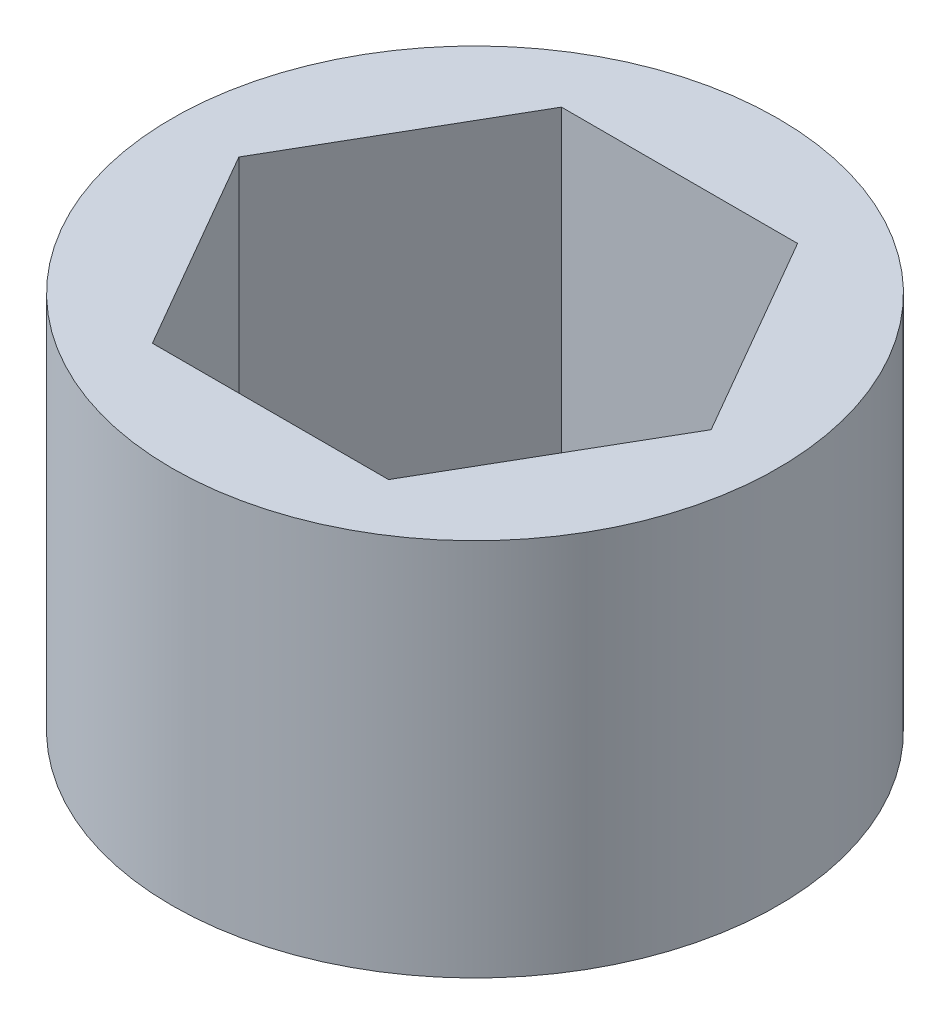
ISO-10303-21;
HEADER;
FILE_DESCRIPTION(('STEP AP214'),'2;1');
FILE_NAME('part.step','',(''),(''),'','','');
FILE_SCHEMA(('AUTOMOTIVE_DESIGN { 1 0 10303 214 1 1 1 1 }'));
ENDSEC;
DATA;
#1=APPLICATION_CONTEXT('core data for automotive mechanical design processes');
#2=APPLICATION_PROTOCOL_DEFINITION('international standard','automotive_design',2000,#1);
#3=PRODUCT_CONTEXT('',#1,'mechanical');
#4=PRODUCT('Part','Part','',(#3));
#5=PRODUCT_RELATED_PRODUCT_CATEGORY('part','',(#4));
#6=PRODUCT_DEFINITION_FORMATION('','',#4);
#7=PRODUCT_DEFINITION_CONTEXT('part definition',#1,'design');
#8=PRODUCT_DEFINITION('design','',#6,#7);
#9=PRODUCT_DEFINITION_SHAPE('','',#8);
#10=(LENGTH_UNIT() NAMED_UNIT(*) SI_UNIT(.MILLI.,.METRE.));
#11=(NAMED_UNIT(*) PLANE_ANGLE_UNIT() SI_UNIT($,.RADIAN.));
#12=(NAMED_UNIT(*) SI_UNIT($,.STERADIAN.) SOLID_ANGLE_UNIT());
#13=UNCERTAINTY_MEASURE_WITH_UNIT(LENGTH_MEASURE(1.E-05),#10,'distance_accuracy_value','');
#14=(GEOMETRIC_REPRESENTATION_CONTEXT(3) GLOBAL_UNCERTAINTY_ASSIGNED_CONTEXT((#13)) GLOBAL_UNIT_ASSIGNED_CONTEXT((#10,
#11,#12)) REPRESENTATION_CONTEXT('',''));
#15=CARTESIAN_POINT('',(0.,0.,0.));
#16=DIRECTION('',(0.,0.,1.));
#17=DIRECTION('',(1.,0.,0.));
#18=AXIS2_PLACEMENT_3D('',#15,#16,#17);
#19=CARTESIAN_POINT('',(0.,12.7,0.));
#20=DIRECTION('',(0.,1.,0.));
#21=DIRECTION('',(0.,0.,1.));
#22=AXIS2_PLACEMENT_3D('',#19,#20,#21);
#23=PLANE('',#22);
#24=CARTESIAN_POINT('',(0.,12.7,0.));
#25=DIRECTION('',(0.,1.,0.));
#26=DIRECTION('',(0.,0.,1.));
#27=AXIS2_PLACEMENT_3D('',#24,#25,#26);
#28=CIRCLE('',#27,10.16);
#29=CARTESIAN_POINT('',(0.,12.7,10.16));
#30=VERTEX_POINT('',#29);
#31=EDGE_CURVE('E11',#30,#30,#28,.T.);
#32=ORIENTED_EDGE('',*,*,#31,.T.);
#33=EDGE_LOOP('',(#32));
#34=FACE_BOUND('',#33,.T.);
#35=DIRECTION('',(-0.5,0.,-0.866025403784438));
#36=VECTOR('',#35,1.);
#37=CARTESIAN_POINT('',(7.9189362922049,12.7,0.));
#38=LINE('',#37,#36);
#39=CARTESIAN_POINT('',(7.9189362922049,12.7,0.));
#40=VERTEX_POINT('',#39);
#41=CARTESIAN_POINT('',(3.95946814610245,12.7,-6.858));
#42=VERTEX_POINT('',#41);
#43=EDGE_CURVE('E97',#40,#42,#38,.T.);
#44=ORIENTED_EDGE('',*,*,#43,.F.);
#45=DIRECTION('',(0.5,0.,-0.866025403784439));
#46=VECTOR('',#45,1.);
#47=CARTESIAN_POINT('',(3.95946814610245,12.7,6.858));
#48=LINE('',#47,#46);
#49=CARTESIAN_POINT('',(3.95946814610245,12.7,6.858));
#50=VERTEX_POINT('',#49);
#51=EDGE_CURVE('E89',#50,#40,#48,.T.);
#52=ORIENTED_EDGE('',*,*,#51,.F.);
#53=DIRECTION('',(1.,0.,0.));
#54=VECTOR('',#53,1.);
#55=CARTESIAN_POINT('',(-3.95946814610245,12.7,6.858));
#56=LINE('',#55,#54);
#57=CARTESIAN_POINT('',(-3.95946814610245,12.7,6.858));
#58=VERTEX_POINT('',#57);
#59=EDGE_CURVE('E117',#58,#50,#56,.T.);
#60=ORIENTED_EDGE('',*,*,#59,.F.);
#61=DIRECTION('',(0.5,0.,0.866025403784439));
#62=VECTOR('',#61,1.);
#63=CARTESIAN_POINT('',(-7.91893629220491,12.7,0.));
#64=LINE('',#63,#62);
#65=CARTESIAN_POINT('',(-7.91893629220491,12.7,0.));
#66=VERTEX_POINT('',#65);
#67=EDGE_CURVE('E115',#66,#58,#64,.T.);
#68=ORIENTED_EDGE('',*,*,#67,.F.);
#69=DIRECTION('',(-0.5,0.,0.866025403784439));
#70=VECTOR('',#69,1.);
#71=CARTESIAN_POINT('',(-3.95946814610245,12.7,-6.858));
#72=LINE('',#71,#70);
#73=CARTESIAN_POINT('',(-3.95946814610245,12.7,-6.858));
#74=VERTEX_POINT('',#73);
#75=EDGE_CURVE('E111',#74,#66,#72,.T.);
#76=ORIENTED_EDGE('',*,*,#75,.F.);
#77=DIRECTION('',(-1.,0.,0.));
#78=VECTOR('',#77,1.);
#79=CARTESIAN_POINT('',(3.95946814610245,12.7,-6.858));
#80=LINE('',#79,#78);
#81=EDGE_CURVE('E109',#42,#74,#80,.T.);
#82=ORIENTED_EDGE('',*,*,#81,.F.);
#83=EDGE_LOOP('',(#44,#52,#60,#68,#76,#82));
#84=FACE_BOUND('',#83,.T.);
#85=ADVANCED_FACE('F36',(#34,#84),#23,.T.);
#86=CARTESIAN_POINT('',(0.,0.,0.));
#87=DIRECTION('',(0.,1.,0.));
#88=DIRECTION('',(0.,0.,1.));
#89=AXIS2_PLACEMENT_3D('',#86,#87,#88);
#90=PLANE('',#89);
#91=CARTESIAN_POINT('',(0.,0.,0.));
#92=DIRECTION('',(0.,1.,0.));
#93=DIRECTION('',(0.,0.,1.));
#94=AXIS2_PLACEMENT_3D('',#91,#92,#93);
#95=CIRCLE('',#94,10.16);
#96=CARTESIAN_POINT('',(0.,0.,10.16));
#97=VERTEX_POINT('',#96);
#98=EDGE_CURVE('E40',#97,#97,#95,.T.);
#99=ORIENTED_EDGE('',*,*,#98,.F.);
#100=EDGE_LOOP('',(#99));
#101=FACE_BOUND('',#100,.T.);
#102=DIRECTION('',(0.5,0.,-0.866025403784439));
#103=VECTOR('',#102,1.);
#104=CARTESIAN_POINT('',(3.95946814610245,0.,6.858));
#105=LINE('',#104,#103);
#106=CARTESIAN_POINT('',(3.95946814610245,0.,6.858));
#107=VERTEX_POINT('',#106);
#108=CARTESIAN_POINT('',(7.9189362922049,0.,0.));
#109=VERTEX_POINT('',#108);
#110=EDGE_CURVE('E59',#107,#109,#105,.T.);
#111=ORIENTED_EDGE('',*,*,#110,.T.);
#112=DIRECTION('',(-0.5,0.,-0.866025403784438));
#113=VECTOR('',#112,1.);
#114=CARTESIAN_POINT('',(7.9189362922049,0.,0.));
#115=LINE('',#114,#113);
#116=CARTESIAN_POINT('',(3.95946814610245,0.,-6.858));
#117=VERTEX_POINT('',#116);
#118=EDGE_CURVE('E104',#109,#117,#115,.T.);
#119=ORIENTED_EDGE('',*,*,#118,.T.);
#120=DIRECTION('',(-1.,0.,0.));
#121=VECTOR('',#120,1.);
#122=CARTESIAN_POINT('',(3.95946814610245,0.,-6.858));
#123=LINE('',#122,#121);
#124=CARTESIAN_POINT('',(-3.95946814610245,0.,-6.858));
#125=VERTEX_POINT('',#124);
#126=EDGE_CURVE('E121',#117,#125,#123,.T.);
#127=ORIENTED_EDGE('',*,*,#126,.T.);
#128=DIRECTION('',(-0.5,0.,0.866025403784439));
#129=VECTOR('',#128,1.);
#130=CARTESIAN_POINT('',(-3.95946814610245,0.,-6.858));
#131=LINE('',#130,#129);
#132=CARTESIAN_POINT('',(-7.91893629220491,0.,0.));
#133=VERTEX_POINT('',#132);
#134=EDGE_CURVE('E124',#125,#133,#131,.T.);
#135=ORIENTED_EDGE('',*,*,#134,.T.);
#136=DIRECTION('',(0.5,0.,0.866025403784439));
#137=VECTOR('',#136,1.);
#138=CARTESIAN_POINT('',(-7.91893629220491,0.,0.));
#139=LINE('',#138,#137);
#140=CARTESIAN_POINT('',(-3.95946814610245,0.,6.858));
#141=VERTEX_POINT('',#140);
#142=EDGE_CURVE('E127',#133,#141,#139,.T.);
#143=ORIENTED_EDGE('',*,*,#142,.T.);
#144=DIRECTION('',(1.,0.,0.));
#145=VECTOR('',#144,1.);
#146=CARTESIAN_POINT('',(-3.95946814610245,0.,6.858));
#147=LINE('',#146,#145);
#148=EDGE_CURVE('E98',#141,#107,#147,.T.);
#149=ORIENTED_EDGE('',*,*,#148,.T.);
#150=EDGE_LOOP('',(#111,#119,#127,#135,#143,#149));
#151=FACE_BOUND('',#150,.T.);
#152=ADVANCED_FACE('F144',(#101,#151),#90,.F.);
#153=CARTESIAN_POINT('',(0.,12.7,0.));
#154=DIRECTION('',(0.,-1.,0.));
#155=DIRECTION('',(0.,0.,-1.));
#156=AXIS2_PLACEMENT_3D('',#153,#154,#155);
#157=CYLINDRICAL_SURFACE('',#156,10.16);
#158=ORIENTED_EDGE('',*,*,#31,.F.);
#159=EDGE_LOOP('',(#158));
#160=FACE_BOUND('',#159,.T.);
#161=ORIENTED_EDGE('',*,*,#98,.T.);
#162=EDGE_LOOP('',(#161));
#163=FACE_BOUND('',#162,.T.);
#164=ADVANCED_FACE('F38',(#160,#163),#157,.T.);
#165=CARTESIAN_POINT('',(3.95946814610245,12.7,6.858));
#166=DIRECTION('',(-0.866025403784439,0.,-0.5));
#167=DIRECTION('',(-0.5,0.,0.866025403784439));
#168=AXIS2_PLACEMENT_3D('',#165,#166,#167);
#169=PLANE('',#168);
#170=ORIENTED_EDGE('',*,*,#110,.F.);
#171=DIRECTION('',(0.,-1.,0.));
#172=VECTOR('',#171,1.);
#173=CARTESIAN_POINT('',(3.95946814610245,12.7,6.858));
#174=LINE('',#173,#172);
#175=EDGE_CURVE('E93',#50,#107,#174,.T.);
#176=ORIENTED_EDGE('',*,*,#175,.F.);
#177=ORIENTED_EDGE('',*,*,#51,.T.);
#178=DIRECTION('',(0.,-1.,0.));
#179=VECTOR('',#178,1.);
#180=CARTESIAN_POINT('',(7.9189362922049,12.7,0.));
#181=LINE('',#180,#179);
#182=EDGE_CURVE('E92',#40,#109,#181,.T.);
#183=ORIENTED_EDGE('',*,*,#182,.T.);
#184=EDGE_LOOP('',(#170,#176,#177,#183));
#185=FACE_BOUND('',#184,.T.);
#186=ADVANCED_FACE('F91',(#185),#169,.T.);
#187=CARTESIAN_POINT('',(7.9189362922049,12.7,0.));
#188=DIRECTION('',(-0.866025403784439,0.,0.5));
#189=DIRECTION('',(0.5,0.,0.866025403784439));
#190=AXIS2_PLACEMENT_3D('',#187,#188,#189);
#191=PLANE('',#190);
#192=ORIENTED_EDGE('',*,*,#118,.F.);
#193=ORIENTED_EDGE('',*,*,#182,.F.);
#194=ORIENTED_EDGE('',*,*,#43,.T.);
#195=DIRECTION('',(0.,-1.,0.));
#196=VECTOR('',#195,1.);
#197=CARTESIAN_POINT('',(3.95946814610245,12.7,-6.858));
#198=LINE('',#197,#196);
#199=EDGE_CURVE('E105',#42,#117,#198,.T.);
#200=ORIENTED_EDGE('',*,*,#199,.T.);
#201=EDGE_LOOP('',(#192,#193,#194,#200));
#202=FACE_BOUND('',#201,.T.);
#203=ADVANCED_FACE('F101',(#202),#191,.T.);
#204=CARTESIAN_POINT('',(3.95946814610245,12.7,-6.858));
#205=DIRECTION('',(0.,0.,1.));
#206=DIRECTION('',(1.,0.,0.));
#207=AXIS2_PLACEMENT_3D('',#204,#205,#206);
#208=PLANE('',#207);
#209=ORIENTED_EDGE('',*,*,#126,.F.);
#210=ORIENTED_EDGE('',*,*,#199,.F.);
#211=ORIENTED_EDGE('',*,*,#81,.T.);
#212=DIRECTION('',(0.,-1.,0.));
#213=VECTOR('',#212,1.);
#214=CARTESIAN_POINT('',(-3.95946814610245,12.7,-6.858));
#215=LINE('',#214,#213);
#216=EDGE_CURVE('E136',#74,#125,#215,.T.);
#217=ORIENTED_EDGE('',*,*,#216,.T.);
#218=EDGE_LOOP('',(#209,#210,#211,#217));
#219=FACE_BOUND('',#218,.T.);
#220=ADVANCED_FACE('F140',(#219),#208,.T.);
#221=CARTESIAN_POINT('',(-3.95946814610245,12.7,-6.858));
#222=DIRECTION('',(0.866025403784439,0.,0.5));
#223=DIRECTION('',(0.5,0.,-0.866025403784439));
#224=AXIS2_PLACEMENT_3D('',#221,#222,#223);
#225=PLANE('',#224);
#226=ORIENTED_EDGE('',*,*,#134,.F.);
#227=ORIENTED_EDGE('',*,*,#216,.F.);
#228=ORIENTED_EDGE('',*,*,#75,.T.);
#229=DIRECTION('',(0.,-1.,0.));
#230=VECTOR('',#229,1.);
#231=CARTESIAN_POINT('',(-7.91893629220491,12.7,0.));
#232=LINE('',#231,#230);
#233=EDGE_CURVE('E134',#66,#133,#232,.T.);
#234=ORIENTED_EDGE('',*,*,#233,.T.);
#235=EDGE_LOOP('',(#226,#227,#228,#234));
#236=FACE_BOUND('',#235,.T.);
#237=ADVANCED_FACE('F152',(#236),#225,.T.);
#238=CARTESIAN_POINT('',(-7.91893629220491,12.7,0.));
#239=DIRECTION('',(0.866025403784438,0.,-0.5));
#240=DIRECTION('',(-0.5,0.,-0.866025403784439));
#241=AXIS2_PLACEMENT_3D('',#238,#239,#240);
#242=PLANE('',#241);
#243=ORIENTED_EDGE('',*,*,#142,.F.);
#244=ORIENTED_EDGE('',*,*,#233,.F.);
#245=ORIENTED_EDGE('',*,*,#67,.T.);
#246=DIRECTION('',(0.,-1.,0.));
#247=VECTOR('',#246,1.);
#248=CARTESIAN_POINT('',(-3.95946814610245,12.7,6.858));
#249=LINE('',#248,#247);
#250=EDGE_CURVE('E51',#58,#141,#249,.T.);
#251=ORIENTED_EDGE('',*,*,#250,.T.);
#252=EDGE_LOOP('',(#243,#244,#245,#251));
#253=FACE_BOUND('',#252,.T.);
#254=ADVANCED_FACE('F150',(#253),#242,.T.);
#255=CARTESIAN_POINT('',(-3.95946814610245,12.7,6.858));
#256=DIRECTION('',(0.,0.,-1.));
#257=DIRECTION('',(-1.,0.,0.));
#258=AXIS2_PLACEMENT_3D('',#255,#256,#257);
#259=PLANE('',#258);
#260=ORIENTED_EDGE('',*,*,#148,.F.);
#261=ORIENTED_EDGE('',*,*,#250,.F.);
#262=ORIENTED_EDGE('',*,*,#59,.T.);
#263=ORIENTED_EDGE('',*,*,#175,.T.);
#264=EDGE_LOOP('',(#260,#261,#262,#263));
#265=FACE_BOUND('',#264,.T.);
#266=ADVANCED_FACE('F146',(#265),#259,.T.);
#267=CLOSED_SHELL('',(#85,#152,#164,#186,#203,#220,#237,#254,#266));
#268=MANIFOLD_SOLID_BREP('B2',#267);
#269=ADVANCED_BREP_SHAPE_REPRESENTATION('',(#18,#268),#14);
#270=SHAPE_DEFINITION_REPRESENTATION(#9,#269);
ENDSEC;
END-ISO-10303-21;
